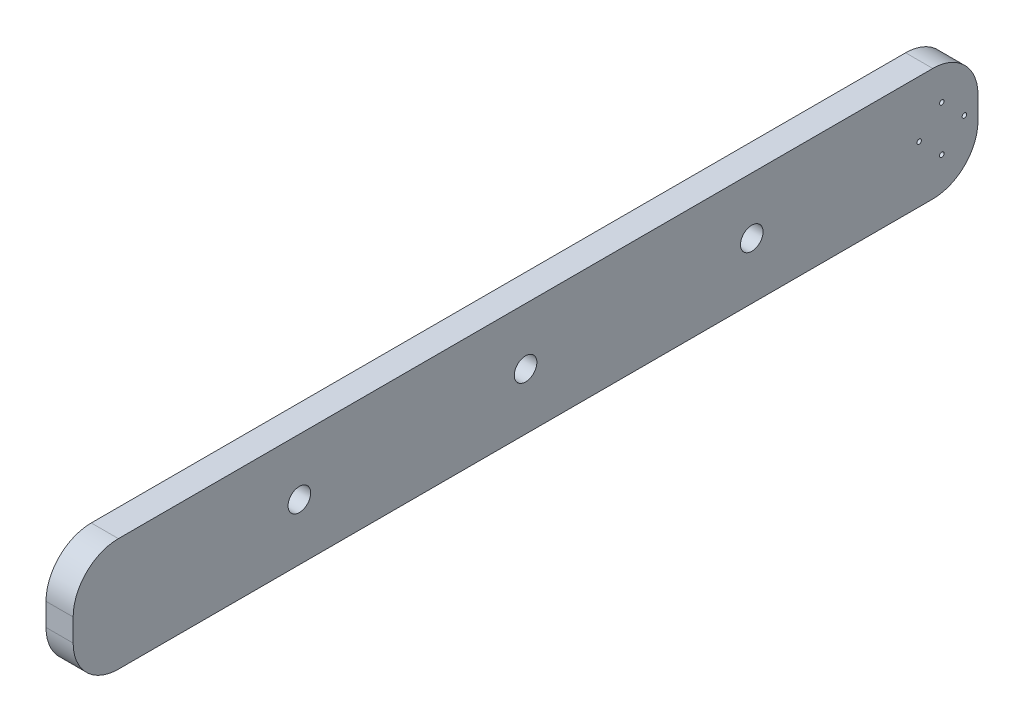
ISO-10303-21;
HEADER;
FILE_DESCRIPTION(('STEP AP214'),'2;1');
FILE_NAME('part.step','',(''),(''),'','','');
FILE_SCHEMA(('AUTOMOTIVE_DESIGN { 1 0 10303 214 1 1 1 1 }'));
ENDSEC;
DATA;
#1=APPLICATION_CONTEXT('core data for automotive mechanical design processes');
#2=APPLICATION_PROTOCOL_DEFINITION('international standard','automotive_design',2000,#1);
#3=PRODUCT_CONTEXT('',#1,'mechanical');
#4=PRODUCT('Part','Part','',(#3));
#5=PRODUCT_RELATED_PRODUCT_CATEGORY('part','',(#4));
#6=PRODUCT_DEFINITION_FORMATION('','',#4);
#7=PRODUCT_DEFINITION_CONTEXT('part definition',#1,'design');
#8=PRODUCT_DEFINITION('design','',#6,#7);
#9=PRODUCT_DEFINITION_SHAPE('','',#8);
#10=(LENGTH_UNIT() NAMED_UNIT(*) SI_UNIT(.MILLI.,.METRE.));
#11=(NAMED_UNIT(*) PLANE_ANGLE_UNIT() SI_UNIT($,.RADIAN.));
#12=(NAMED_UNIT(*) SI_UNIT($,.STERADIAN.) SOLID_ANGLE_UNIT());
#13=UNCERTAINTY_MEASURE_WITH_UNIT(LENGTH_MEASURE(1.E-05),#10,'distance_accuracy_value','');
#14=(GEOMETRIC_REPRESENTATION_CONTEXT(3) GLOBAL_UNCERTAINTY_ASSIGNED_CONTEXT((#13)) GLOBAL_UNIT_ASSIGNED_CONTEXT((#10,
#11,#12)) REPRESENTATION_CONTEXT('',''));
#15=CARTESIAN_POINT('',(0.,0.,0.));
#16=DIRECTION('',(0.,0.,1.));
#17=DIRECTION('',(1.,0.,0.));
#18=AXIS2_PLACEMENT_3D('',#15,#16,#17);
#19=CARTESIAN_POINT('',(6.,-2.49999999999998,-90.));
#20=DIRECTION('',(-1.,0.,0.));
#21=DIRECTION('',(0.,0.,1.));
#22=AXIS2_PLACEMENT_3D('',#19,#20,#21);
#23=CYLINDRICAL_SURFACE('',#22,9.99999999999999);
#24=CARTESIAN_POINT('',(0.,-2.49999999999998,-90.));
#25=DIRECTION('',(1.,0.,0.));
#26=DIRECTION('',(0.,0.,1.));
#27=AXIS2_PLACEMENT_3D('',#24,#25,#26);
#28=CIRCLE('',#27,9.99999999999999);
#29=CARTESIAN_POINT('',(0.,-12.5,-90.));
#30=VERTEX_POINT('',#29);
#31=CARTESIAN_POINT('',(0.,-2.49999999999998,-100.));
#32=VERTEX_POINT('',#31);
#33=EDGE_CURVE('E129',#30,#32,#28,.T.);
#34=ORIENTED_EDGE('',*,*,#33,.T.);
#35=DIRECTION('',(-1.,0.,0.));
#36=VECTOR('',#35,1.);
#37=CARTESIAN_POINT('',(6.,-2.49999999999998,-100.));
#38=LINE('',#37,#36);
#39=CARTESIAN_POINT('',(6.,-2.49999999999998,-100.));
#40=VERTEX_POINT('',#39);
#41=EDGE_CURVE('E11',#40,#32,#38,.T.);
#42=ORIENTED_EDGE('',*,*,#41,.F.);
#43=CARTESIAN_POINT('',(6.,-2.49999999999998,-90.));
#44=DIRECTION('',(1.,0.,0.));
#45=DIRECTION('',(0.,0.,1.));
#46=AXIS2_PLACEMENT_3D('',#43,#44,#45);
#47=CIRCLE('',#46,9.99999999999999);
#48=CARTESIAN_POINT('',(6.,-12.5,-90.));
#49=VERTEX_POINT('',#48);
#50=EDGE_CURVE('E144',#49,#40,#47,.T.);
#51=ORIENTED_EDGE('',*,*,#50,.F.);
#52=DIRECTION('',(-1.,0.,0.));
#53=VECTOR('',#52,1.);
#54=CARTESIAN_POINT('',(6.,-12.5,-90.));
#55=LINE('',#54,#53);
#56=EDGE_CURVE('E125',#49,#30,#55,.T.);
#57=ORIENTED_EDGE('',*,*,#56,.T.);
#58=EDGE_LOOP('',(#34,#42,#51,#57));
#59=FACE_BOUND('',#58,.T.);
#60=ADVANCED_FACE('F33',(#59),#23,.T.);
#61=CARTESIAN_POINT('',(6.,-2.49999999999998,-100.));
#62=DIRECTION('',(0.,0.,1.));
#63=DIRECTION('',(0.,-1.,0.));
#64=AXIS2_PLACEMENT_3D('',#61,#62,#63);
#65=PLANE('',#64);
#66=DIRECTION('',(0.,1.,0.));
#67=VECTOR('',#66,1.);
#68=CARTESIAN_POINT('',(0.,-2.49999999999998,-100.));
#69=LINE('',#68,#67);
#70=CARTESIAN_POINT('',(0.,2.50000000000001,-100.));
#71=VERTEX_POINT('',#70);
#72=EDGE_CURVE('E132',#32,#71,#69,.T.);
#73=ORIENTED_EDGE('',*,*,#72,.T.);
#74=DIRECTION('',(-1.,0.,0.));
#75=VECTOR('',#74,1.);
#76=CARTESIAN_POINT('',(6.,2.50000000000001,-100.));
#77=LINE('',#76,#75);
#78=CARTESIAN_POINT('',(6.,2.50000000000001,-100.));
#79=VERTEX_POINT('',#78);
#80=EDGE_CURVE('E41',#79,#71,#77,.T.);
#81=ORIENTED_EDGE('',*,*,#80,.F.);
#82=DIRECTION('',(0.,1.,0.));
#83=VECTOR('',#82,1.);
#84=CARTESIAN_POINT('',(6.,-2.49999999999998,-100.));
#85=LINE('',#84,#83);
#86=EDGE_CURVE('E92',#40,#79,#85,.T.);
#87=ORIENTED_EDGE('',*,*,#86,.F.);
#88=ORIENTED_EDGE('',*,*,#41,.T.);
#89=EDGE_LOOP('',(#73,#81,#87,#88));
#90=FACE_BOUND('',#89,.T.);
#91=ADVANCED_FACE('F257',(#90),#65,.F.);
#92=CARTESIAN_POINT('',(6.,2.50000000000001,-90.));
#93=DIRECTION('',(-1.,0.,0.));
#94=DIRECTION('',(0.,0.,1.));
#95=AXIS2_PLACEMENT_3D('',#92,#93,#94);
#96=CYLINDRICAL_SURFACE('',#95,10.);
#97=CARTESIAN_POINT('',(0.,2.50000000000001,-90.));
#98=DIRECTION('',(1.,0.,0.));
#99=DIRECTION('',(0.,0.,1.));
#100=AXIS2_PLACEMENT_3D('',#97,#98,#99);
#101=CIRCLE('',#100,10.);
#102=CARTESIAN_POINT('',(0.,12.5,-90.));
#103=VERTEX_POINT('',#102);
#104=EDGE_CURVE('E135',#71,#103,#101,.T.);
#105=ORIENTED_EDGE('',*,*,#104,.T.);
#106=DIRECTION('',(-1.,0.,0.));
#107=VECTOR('',#106,1.);
#108=CARTESIAN_POINT('',(6.,12.5,-90.));
#109=LINE('',#108,#107);
#110=CARTESIAN_POINT('',(6.,12.5,-90.));
#111=VERTEX_POINT('',#110);
#112=EDGE_CURVE('E151',#111,#103,#109,.T.);
#113=ORIENTED_EDGE('',*,*,#112,.F.);
#114=CARTESIAN_POINT('',(6.,2.50000000000001,-90.));
#115=DIRECTION('',(1.,0.,0.));
#116=DIRECTION('',(0.,0.,1.));
#117=AXIS2_PLACEMENT_3D('',#114,#115,#116);
#118=CIRCLE('',#117,10.);
#119=EDGE_CURVE('E159',#79,#111,#118,.T.);
#120=ORIENTED_EDGE('',*,*,#119,.F.);
#121=ORIENTED_EDGE('',*,*,#80,.T.);
#122=EDGE_LOOP('',(#105,#113,#120,#121));
#123=FACE_BOUND('',#122,.T.);
#124=ADVANCED_FACE('F157',(#123),#96,.T.);
#125=CARTESIAN_POINT('',(6.,12.5,-90.));
#126=DIRECTION('',(0.,-1.,0.));
#127=DIRECTION('',(0.,0.,-1.));
#128=AXIS2_PLACEMENT_3D('',#125,#126,#127);
#129=PLANE('',#128);
#130=DIRECTION('',(0.,0.,1.));
#131=VECTOR('',#130,1.);
#132=CARTESIAN_POINT('',(0.,12.5,-90.));
#133=LINE('',#132,#131);
#134=CARTESIAN_POINT('',(0.,12.5,90.));
#135=VERTEX_POINT('',#134);
#136=EDGE_CURVE('E137',#103,#135,#133,.T.);
#137=ORIENTED_EDGE('',*,*,#136,.T.);
#138=DIRECTION('',(-1.,0.,0.));
#139=VECTOR('',#138,1.);
#140=CARTESIAN_POINT('',(6.,12.5,90.));
#141=LINE('',#140,#139);
#142=CARTESIAN_POINT('',(6.,12.5,90.));
#143=VERTEX_POINT('',#142);
#144=EDGE_CURVE('E148',#143,#135,#141,.T.);
#145=ORIENTED_EDGE('',*,*,#144,.F.);
#146=DIRECTION('',(0.,0.,1.));
#147=VECTOR('',#146,1.);
#148=CARTESIAN_POINT('',(6.,12.5,-90.));
#149=LINE('',#148,#147);
#150=EDGE_CURVE('E171',#111,#143,#149,.T.);
#151=ORIENTED_EDGE('',*,*,#150,.F.);
#152=ORIENTED_EDGE('',*,*,#112,.T.);
#153=EDGE_LOOP('',(#137,#145,#151,#152));
#154=FACE_BOUND('',#153,.T.);
#155=ADVANCED_FACE('F167',(#154),#129,.F.);
#156=CARTESIAN_POINT('',(6.,2.49999999999999,90.));
#157=DIRECTION('',(-1.,0.,0.));
#158=DIRECTION('',(0.,0.,1.));
#159=AXIS2_PLACEMENT_3D('',#156,#157,#158);
#160=CYLINDRICAL_SURFACE('',#159,10.);
#161=CARTESIAN_POINT('',(0.,2.49999999999999,90.));
#162=DIRECTION('',(1.,0.,0.));
#163=DIRECTION('',(0.,0.,-1.));
#164=AXIS2_PLACEMENT_3D('',#161,#162,#163);
#165=CIRCLE('',#164,10.);
#166=CARTESIAN_POINT('',(0.,2.49999999999999,100.));
#167=VERTEX_POINT('',#166);
#168=EDGE_CURVE('E139',#135,#167,#165,.T.);
#169=ORIENTED_EDGE('',*,*,#168,.T.);
#170=DIRECTION('',(-1.,0.,0.));
#171=VECTOR('',#170,1.);
#172=CARTESIAN_POINT('',(6.,2.49999999999999,100.));
#173=LINE('',#172,#171);
#174=CARTESIAN_POINT('',(6.,2.49999999999999,100.));
#175=VERTEX_POINT('',#174);
#176=EDGE_CURVE('E120',#175,#167,#173,.T.);
#177=ORIENTED_EDGE('',*,*,#176,.F.);
#178=CARTESIAN_POINT('',(6.,2.49999999999999,90.));
#179=DIRECTION('',(1.,0.,0.));
#180=DIRECTION('',(0.,0.,-1.));
#181=AXIS2_PLACEMENT_3D('',#178,#179,#180);
#182=CIRCLE('',#181,10.);
#183=EDGE_CURVE('E111',#143,#175,#182,.T.);
#184=ORIENTED_EDGE('',*,*,#183,.F.);
#185=ORIENTED_EDGE('',*,*,#144,.T.);
#186=EDGE_LOOP('',(#169,#177,#184,#185));
#187=FACE_BOUND('',#186,.T.);
#188=ADVANCED_FACE('F170',(#187),#160,.T.);
#189=CARTESIAN_POINT('',(6.,-2.50000000000001,100.));
#190=DIRECTION('',(0.,0.,-1.));
#191=DIRECTION('',(-1.,0.,0.));
#192=AXIS2_PLACEMENT_3D('',#189,#190,#191);
#193=PLANE('',#192);
#194=DIRECTION('',(0.,-1.,0.));
#195=VECTOR('',#194,1.);
#196=CARTESIAN_POINT('',(0.,-2.50000000000001,100.));
#197=LINE('',#196,#195);
#198=CARTESIAN_POINT('',(0.,-2.50000000000001,100.));
#199=VERTEX_POINT('',#198);
#200=EDGE_CURVE('E119',#167,#199,#197,.T.);
#201=ORIENTED_EDGE('',*,*,#200,.T.);
#202=DIRECTION('',(-1.,0.,0.));
#203=VECTOR('',#202,1.);
#204=CARTESIAN_POINT('',(6.,-2.50000000000001,100.));
#205=LINE('',#204,#203);
#206=CARTESIAN_POINT('',(6.,-2.50000000000001,100.));
#207=VERTEX_POINT('',#206);
#208=EDGE_CURVE('E116',#207,#199,#205,.T.);
#209=ORIENTED_EDGE('',*,*,#208,.F.);
#210=DIRECTION('',(0.,-1.,0.));
#211=VECTOR('',#210,1.);
#212=CARTESIAN_POINT('',(6.,-2.50000000000001,100.));
#213=LINE('',#212,#211);
#214=EDGE_CURVE('E105',#175,#207,#213,.T.);
#215=ORIENTED_EDGE('',*,*,#214,.F.);
#216=ORIENTED_EDGE('',*,*,#176,.T.);
#217=EDGE_LOOP('',(#201,#209,#215,#216));
#218=FACE_BOUND('',#217,.T.);
#219=ADVANCED_FACE('F117',(#218),#193,.F.);
#220=CARTESIAN_POINT('',(6.,-2.50000000000001,90.));
#221=DIRECTION('',(-1.,0.,0.));
#222=DIRECTION('',(0.,0.,1.));
#223=AXIS2_PLACEMENT_3D('',#220,#221,#222);
#224=CYLINDRICAL_SURFACE('',#223,9.99999999999999);
#225=CARTESIAN_POINT('',(0.,-2.50000000000001,90.));
#226=DIRECTION('',(1.,0.,0.));
#227=DIRECTION('',(0.,0.,1.));
#228=AXIS2_PLACEMENT_3D('',#225,#226,#227);
#229=CIRCLE('',#228,9.99999999999999);
#230=CARTESIAN_POINT('',(0.,-12.5,90.));
#231=VERTEX_POINT('',#230);
#232=EDGE_CURVE('E78',#199,#231,#229,.T.);
#233=ORIENTED_EDGE('',*,*,#232,.T.);
#234=DIRECTION('',(-1.,0.,0.));
#235=VECTOR('',#234,1.);
#236=CARTESIAN_POINT('',(6.,-12.5,90.));
#237=LINE('',#236,#235);
#238=CARTESIAN_POINT('',(6.,-12.5,90.));
#239=VERTEX_POINT('',#238);
#240=EDGE_CURVE('E121',#239,#231,#237,.T.);
#241=ORIENTED_EDGE('',*,*,#240,.F.);
#242=CARTESIAN_POINT('',(6.,-2.50000000000001,90.));
#243=DIRECTION('',(1.,0.,0.));
#244=DIRECTION('',(0.,0.,1.));
#245=AXIS2_PLACEMENT_3D('',#242,#243,#244);
#246=CIRCLE('',#245,9.99999999999999);
#247=EDGE_CURVE('E109',#207,#239,#246,.T.);
#248=ORIENTED_EDGE('',*,*,#247,.F.);
#249=ORIENTED_EDGE('',*,*,#208,.T.);
#250=EDGE_LOOP('',(#233,#241,#248,#249));
#251=FACE_BOUND('',#250,.T.);
#252=ADVANCED_FACE('F123',(#251),#224,.T.);
#253=CARTESIAN_POINT('',(6.,-12.5,-90.));
#254=DIRECTION('',(0.,1.,0.));
#255=DIRECTION('',(0.,0.,1.));
#256=AXIS2_PLACEMENT_3D('',#253,#254,#255);
#257=PLANE('',#256);
#258=DIRECTION('',(0.,0.,-1.));
#259=VECTOR('',#258,1.);
#260=CARTESIAN_POINT('',(0.,-12.5,-90.));
#261=LINE('',#260,#259);
#262=EDGE_CURVE('E84',#231,#30,#261,.T.);
#263=ORIENTED_EDGE('',*,*,#262,.T.);
#264=ORIENTED_EDGE('',*,*,#56,.F.);
#265=DIRECTION('',(0.,0.,-1.));
#266=VECTOR('',#265,1.);
#267=CARTESIAN_POINT('',(6.,-12.5,-90.));
#268=LINE('',#267,#266);
#269=EDGE_CURVE('E49',#239,#49,#268,.T.);
#270=ORIENTED_EDGE('',*,*,#269,.F.);
#271=ORIENTED_EDGE('',*,*,#240,.T.);
#272=EDGE_LOOP('',(#263,#264,#270,#271));
#273=FACE_BOUND('',#272,.T.);
#274=ADVANCED_FACE('F264',(#273),#257,.F.);
#275=CARTESIAN_POINT('',(6.,-2.49999999999998,-90.));
#276=DIRECTION('',(-1.,0.,0.));
#277=DIRECTION('',(0.,0.,1.));
#278=AXIS2_PLACEMENT_3D('',#275,#276,#277);
#279=PLANE('',#278);
#280=CARTESIAN_POINT('',(6.,0.,50.));
#281=DIRECTION('',(-1.,0.,0.));
#282=DIRECTION('',(0.,0.,1.));
#283=AXIS2_PLACEMENT_3D('',#280,#281,#282);
#284=CIRCLE('',#283,2.5);
#285=CARTESIAN_POINT('',(6.,0.,52.5));
#286=VERTEX_POINT('',#285);
#287=EDGE_CURVE('E210',#286,#286,#284,.T.);
#288=ORIENTED_EDGE('',*,*,#287,.T.);
#289=EDGE_LOOP('',(#288));
#290=FACE_BOUND('',#289,.T.);
#291=CARTESIAN_POINT('',(6.,0.,0.));
#292=DIRECTION('',(-1.,0.,0.));
#293=DIRECTION('',(0.,0.,1.));
#294=AXIS2_PLACEMENT_3D('',#291,#292,#293);
#295=CIRCLE('',#294,2.5);
#296=CARTESIAN_POINT('',(6.,0.,2.50000000000002));
#297=VERTEX_POINT('',#296);
#298=EDGE_CURVE('E204',#297,#297,#295,.T.);
#299=ORIENTED_EDGE('',*,*,#298,.T.);
#300=EDGE_LOOP('',(#299));
#301=FACE_BOUND('',#300,.T.);
#302=CARTESIAN_POINT('',(6.,0.,-50.));
#303=DIRECTION('',(-1.,0.,0.));
#304=DIRECTION('',(0.,0.,1.));
#305=AXIS2_PLACEMENT_3D('',#302,#303,#304);
#306=CIRCLE('',#305,2.49999999999999);
#307=CARTESIAN_POINT('',(6.,0.,-47.5));
#308=VERTEX_POINT('',#307);
#309=EDGE_CURVE('E198',#308,#308,#306,.T.);
#310=ORIENTED_EDGE('',*,*,#309,.T.);
#311=EDGE_LOOP('',(#310));
#312=FACE_BOUND('',#311,.T.);
#313=CARTESIAN_POINT('',(6.,0.,-87.));
#314=DIRECTION('',(-1.,0.,0.));
#315=DIRECTION('',(0.,0.,-1.));
#316=AXIS2_PLACEMENT_3D('',#313,#314,#315);
#317=CIRCLE('',#316,0.499999999999999);
#318=CARTESIAN_POINT('',(6.,0.,-87.5));
#319=VERTEX_POINT('',#318);
#320=EDGE_CURVE('E192',#319,#319,#317,.T.);
#321=ORIENTED_EDGE('',*,*,#320,.T.);
#322=EDGE_LOOP('',(#321));
#323=FACE_BOUND('',#322,.T.);
#324=CARTESIAN_POINT('',(6.,-5.,-92.));
#325=DIRECTION('',(-1.,0.,0.));
#326=DIRECTION('',(0.,0.,-1.));
#327=AXIS2_PLACEMENT_3D('',#324,#325,#326);
#328=CIRCLE('',#327,0.499999999999999);
#329=CARTESIAN_POINT('',(6.,-5.,-92.5));
#330=VERTEX_POINT('',#329);
#331=EDGE_CURVE('E186',#330,#330,#328,.T.);
#332=ORIENTED_EDGE('',*,*,#331,.T.);
#333=EDGE_LOOP('',(#332));
#334=FACE_BOUND('',#333,.T.);
#335=CARTESIAN_POINT('',(6.,5.,-92.));
#336=DIRECTION('',(-1.,0.,0.));
#337=DIRECTION('',(0.,0.,1.));
#338=AXIS2_PLACEMENT_3D('',#335,#336,#337);
#339=CIRCLE('',#338,0.499999999999999);
#340=CARTESIAN_POINT('',(6.,5.,-91.5));
#341=VERTEX_POINT('',#340);
#342=EDGE_CURVE('E180',#341,#341,#339,.T.);
#343=ORIENTED_EDGE('',*,*,#342,.T.);
#344=EDGE_LOOP('',(#343));
#345=FACE_BOUND('',#344,.T.);
#346=CARTESIAN_POINT('',(6.,0.,-97.));
#347=DIRECTION('',(-1.,0.,0.));
#348=DIRECTION('',(0.,0.,1.));
#349=AXIS2_PLACEMENT_3D('',#346,#347,#348);
#350=CIRCLE('',#349,0.499999999999999);
#351=CARTESIAN_POINT('',(6.,0.,-96.5));
#352=VERTEX_POINT('',#351);
#353=EDGE_CURVE('E133',#352,#352,#350,.T.);
#354=ORIENTED_EDGE('',*,*,#353,.T.);
#355=EDGE_LOOP('',(#354));
#356=FACE_BOUND('',#355,.T.);
#357=ORIENTED_EDGE('',*,*,#50,.T.);
#358=ORIENTED_EDGE('',*,*,#86,.T.);
#359=ORIENTED_EDGE('',*,*,#119,.T.);
#360=ORIENTED_EDGE('',*,*,#150,.T.);
#361=ORIENTED_EDGE('',*,*,#183,.T.);
#362=ORIENTED_EDGE('',*,*,#214,.T.);
#363=ORIENTED_EDGE('',*,*,#247,.T.);
#364=ORIENTED_EDGE('',*,*,#269,.T.);
#365=EDGE_LOOP('',(#357,#358,#359,#360,#361,#362,#363,#364));
#366=FACE_BOUND('',#365,.T.);
#367=ADVANCED_FACE('F107',(#290,#301,#312,#323,#334,#345,#356,#366),#279,.F.);
#368=CARTESIAN_POINT('',(0.,-2.49999999999998,-90.));
#369=DIRECTION('',(-1.,0.,0.));
#370=DIRECTION('',(0.,0.,1.));
#371=AXIS2_PLACEMENT_3D('',#368,#369,#370);
#372=PLANE('',#371);
#373=CARTESIAN_POINT('',(0.,0.,50.));
#374=DIRECTION('',(-1.,0.,0.));
#375=DIRECTION('',(0.,0.,1.));
#376=AXIS2_PLACEMENT_3D('',#373,#374,#375);
#377=CIRCLE('',#376,2.5);
#378=CARTESIAN_POINT('',(0.,0.,52.5));
#379=VERTEX_POINT('',#378);
#380=EDGE_CURVE('E213',#379,#379,#377,.T.);
#381=ORIENTED_EDGE('',*,*,#380,.F.);
#382=EDGE_LOOP('',(#381));
#383=FACE_BOUND('',#382,.T.);
#384=CARTESIAN_POINT('',(0.,0.,0.));
#385=DIRECTION('',(-1.,0.,0.));
#386=DIRECTION('',(0.,0.,1.));
#387=AXIS2_PLACEMENT_3D('',#384,#385,#386);
#388=CIRCLE('',#387,2.5);
#389=CARTESIAN_POINT('',(0.,0.,2.50000000000002));
#390=VERTEX_POINT('',#389);
#391=EDGE_CURVE('E207',#390,#390,#388,.T.);
#392=ORIENTED_EDGE('',*,*,#391,.F.);
#393=EDGE_LOOP('',(#392));
#394=FACE_BOUND('',#393,.T.);
#395=CARTESIAN_POINT('',(0.,0.,-50.));
#396=DIRECTION('',(-1.,0.,0.));
#397=DIRECTION('',(0.,0.,1.));
#398=AXIS2_PLACEMENT_3D('',#395,#396,#397);
#399=CIRCLE('',#398,2.49999999999999);
#400=CARTESIAN_POINT('',(0.,0.,-47.5));
#401=VERTEX_POINT('',#400);
#402=EDGE_CURVE('E201',#401,#401,#399,.T.);
#403=ORIENTED_EDGE('',*,*,#402,.F.);
#404=EDGE_LOOP('',(#403));
#405=FACE_BOUND('',#404,.T.);
#406=CARTESIAN_POINT('',(0.,0.,-87.));
#407=DIRECTION('',(-1.,0.,0.));
#408=DIRECTION('',(0.,0.,-1.));
#409=AXIS2_PLACEMENT_3D('',#406,#407,#408);
#410=CIRCLE('',#409,0.499999999999999);
#411=CARTESIAN_POINT('',(0.,0.,-87.5));
#412=VERTEX_POINT('',#411);
#413=EDGE_CURVE('E195',#412,#412,#410,.T.);
#414=ORIENTED_EDGE('',*,*,#413,.F.);
#415=EDGE_LOOP('',(#414));
#416=FACE_BOUND('',#415,.T.);
#417=CARTESIAN_POINT('',(0.,-5.,-92.));
#418=DIRECTION('',(-1.,0.,0.));
#419=DIRECTION('',(0.,0.,-1.));
#420=AXIS2_PLACEMENT_3D('',#417,#418,#419);
#421=CIRCLE('',#420,0.499999999999999);
#422=CARTESIAN_POINT('',(0.,-5.,-92.5));
#423=VERTEX_POINT('',#422);
#424=EDGE_CURVE('E189',#423,#423,#421,.T.);
#425=ORIENTED_EDGE('',*,*,#424,.F.);
#426=EDGE_LOOP('',(#425));
#427=FACE_BOUND('',#426,.T.);
#428=CARTESIAN_POINT('',(0.,5.,-92.));
#429=DIRECTION('',(-1.,0.,0.));
#430=DIRECTION('',(0.,0.,1.));
#431=AXIS2_PLACEMENT_3D('',#428,#429,#430);
#432=CIRCLE('',#431,0.499999999999999);
#433=CARTESIAN_POINT('',(0.,5.,-91.5));
#434=VERTEX_POINT('',#433);
#435=EDGE_CURVE('E183',#434,#434,#432,.T.);
#436=ORIENTED_EDGE('',*,*,#435,.F.);
#437=EDGE_LOOP('',(#436));
#438=FACE_BOUND('',#437,.T.);
#439=CARTESIAN_POINT('',(0.,0.,-97.));
#440=DIRECTION('',(-1.,0.,0.));
#441=DIRECTION('',(0.,0.,1.));
#442=AXIS2_PLACEMENT_3D('',#439,#440,#441);
#443=CIRCLE('',#442,0.499999999999999);
#444=CARTESIAN_POINT('',(0.,0.,-96.5));
#445=VERTEX_POINT('',#444);
#446=EDGE_CURVE('E177',#445,#445,#443,.T.);
#447=ORIENTED_EDGE('',*,*,#446,.F.);
#448=EDGE_LOOP('',(#447));
#449=FACE_BOUND('',#448,.T.);
#450=ORIENTED_EDGE('',*,*,#33,.F.);
#451=ORIENTED_EDGE('',*,*,#262,.F.);
#452=ORIENTED_EDGE('',*,*,#232,.F.);
#453=ORIENTED_EDGE('',*,*,#200,.F.);
#454=ORIENTED_EDGE('',*,*,#168,.F.);
#455=ORIENTED_EDGE('',*,*,#136,.F.);
#456=ORIENTED_EDGE('',*,*,#104,.F.);
#457=ORIENTED_EDGE('',*,*,#72,.F.);
#458=EDGE_LOOP('',(#450,#451,#452,#453,#454,#455,#456,#457));
#459=FACE_BOUND('',#458,.T.);
#460=ADVANCED_FACE('F163',(#383,#394,#405,#416,#427,#438,#449,#459),#372,.T.);
#461=CARTESIAN_POINT('',(6.,0.,-97.));
#462=DIRECTION('',(-1.,0.,0.));
#463=DIRECTION('',(0.,0.,1.));
#464=AXIS2_PLACEMENT_3D('',#461,#462,#463);
#465=CYLINDRICAL_SURFACE('',#464,0.499999999999999);
#466=ORIENTED_EDGE('',*,*,#353,.F.);
#467=EDGE_LOOP('',(#466));
#468=FACE_BOUND('',#467,.T.);
#469=ORIENTED_EDGE('',*,*,#446,.T.);
#470=EDGE_LOOP('',(#469));
#471=FACE_BOUND('',#470,.T.);
#472=ADVANCED_FACE('F230',(#468,#471),#465,.F.);
#473=CARTESIAN_POINT('',(6.,5.,-92.));
#474=DIRECTION('',(-1.,0.,0.));
#475=DIRECTION('',(0.,0.,1.));
#476=AXIS2_PLACEMENT_3D('',#473,#474,#475);
#477=CYLINDRICAL_SURFACE('',#476,0.499999999999999);
#478=ORIENTED_EDGE('',*,*,#342,.F.);
#479=EDGE_LOOP('',(#478));
#480=FACE_BOUND('',#479,.T.);
#481=ORIENTED_EDGE('',*,*,#435,.T.);
#482=EDGE_LOOP('',(#481));
#483=FACE_BOUND('',#482,.T.);
#484=ADVANCED_FACE('F245',(#480,#483),#477,.F.);
#485=CARTESIAN_POINT('',(6.,-5.,-92.));
#486=DIRECTION('',(-1.,0.,0.));
#487=DIRECTION('',(0.,0.,1.));
#488=AXIS2_PLACEMENT_3D('',#485,#486,#487);
#489=CYLINDRICAL_SURFACE('',#488,0.499999999999999);
#490=ORIENTED_EDGE('',*,*,#331,.F.);
#491=EDGE_LOOP('',(#490));
#492=FACE_BOUND('',#491,.T.);
#493=ORIENTED_EDGE('',*,*,#424,.T.);
#494=EDGE_LOOP('',(#493));
#495=FACE_BOUND('',#494,.T.);
#496=ADVANCED_FACE('F251',(#492,#495),#489,.F.);
#497=CARTESIAN_POINT('',(6.,0.,-87.));
#498=DIRECTION('',(-1.,0.,0.));
#499=DIRECTION('',(0.,0.,1.));
#500=AXIS2_PLACEMENT_3D('',#497,#498,#499);
#501=CYLINDRICAL_SURFACE('',#500,0.499999999999999);
#502=ORIENTED_EDGE('',*,*,#320,.F.);
#503=EDGE_LOOP('',(#502));
#504=FACE_BOUND('',#503,.T.);
#505=ORIENTED_EDGE('',*,*,#413,.T.);
#506=EDGE_LOOP('',(#505));
#507=FACE_BOUND('',#506,.T.);
#508=ADVANCED_FACE('F335',(#504,#507),#501,.F.);
#509=CARTESIAN_POINT('',(6.,0.,-50.));
#510=DIRECTION('',(-1.,0.,0.));
#511=DIRECTION('',(0.,0.,1.));
#512=AXIS2_PLACEMENT_3D('',#509,#510,#511);
#513=CYLINDRICAL_SURFACE('',#512,2.49999999999999);
#514=ORIENTED_EDGE('',*,*,#309,.F.);
#515=EDGE_LOOP('',(#514));
#516=FACE_BOUND('',#515,.T.);
#517=ORIENTED_EDGE('',*,*,#402,.T.);
#518=EDGE_LOOP('',(#517));
#519=FACE_BOUND('',#518,.T.);
#520=ADVANCED_FACE('F345',(#516,#519),#513,.F.);
#521=CARTESIAN_POINT('',(6.,0.,0.));
#522=DIRECTION('',(-1.,0.,0.));
#523=DIRECTION('',(0.,0.,1.));
#524=AXIS2_PLACEMENT_3D('',#521,#522,#523);
#525=CYLINDRICAL_SURFACE('',#524,2.5);
#526=ORIENTED_EDGE('',*,*,#298,.F.);
#527=EDGE_LOOP('',(#526));
#528=FACE_BOUND('',#527,.T.);
#529=ORIENTED_EDGE('',*,*,#391,.T.);
#530=EDGE_LOOP('',(#529));
#531=FACE_BOUND('',#530,.T.);
#532=ADVANCED_FACE('F224',(#528,#531),#525,.F.);
#533=CARTESIAN_POINT('',(6.,0.,50.));
#534=DIRECTION('',(-1.,0.,0.));
#535=DIRECTION('',(0.,0.,1.));
#536=AXIS2_PLACEMENT_3D('',#533,#534,#535);
#537=CYLINDRICAL_SURFACE('',#536,2.5);
#538=ORIENTED_EDGE('',*,*,#287,.F.);
#539=EDGE_LOOP('',(#538));
#540=FACE_BOUND('',#539,.T.);
#541=ORIENTED_EDGE('',*,*,#380,.T.);
#542=EDGE_LOOP('',(#541));
#543=FACE_BOUND('',#542,.T.);
#544=ADVANCED_FACE('F221',(#540,#543),#537,.F.);
#545=CLOSED_SHELL('',(#60,#91,#124,#155,#188,#219,#252,#274,#367,#460,#472,#484,#496,#508,#520,
#532,#544));
#546=MANIFOLD_SOLID_BREP('B2',#545);
#547=ADVANCED_BREP_SHAPE_REPRESENTATION('',(#18,#546),#14);
#548=SHAPE_DEFINITION_REPRESENTATION(#9,#547);
ENDSEC;
END-ISO-10303-21;
